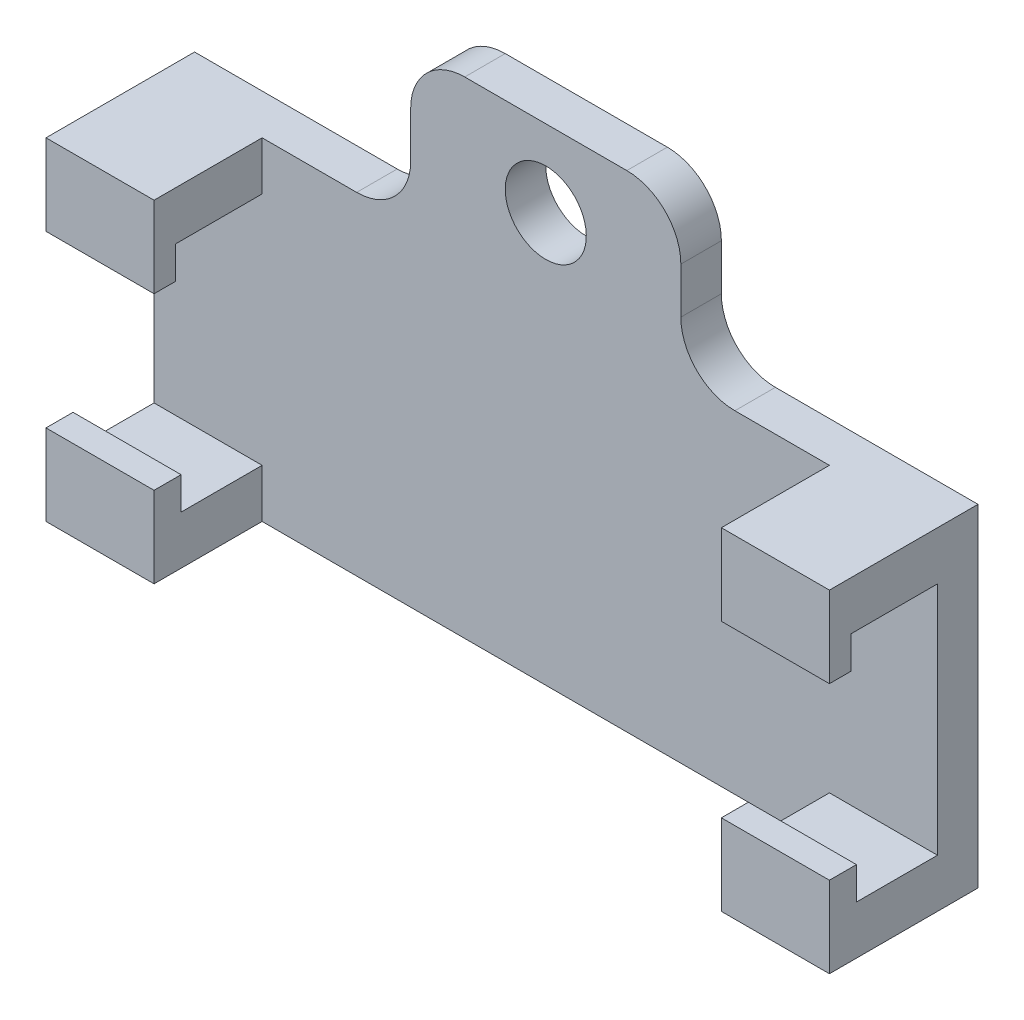
ISO-10303-21;
HEADER;
FILE_DESCRIPTION(('STEP AP214'),'2;1');
FILE_NAME('part.step','',(''),(''),'','','');
FILE_SCHEMA(('AUTOMOTIVE_DESIGN { 1 0 10303 214 1 1 1 1 }'));
ENDSEC;
DATA;
#1=APPLICATION_CONTEXT('core data for automotive mechanical design processes');
#2=APPLICATION_PROTOCOL_DEFINITION('international standard','automotive_design',2000,#1);
#3=PRODUCT_CONTEXT('',#1,'mechanical');
#4=PRODUCT('Part','Part','',(#3));
#5=PRODUCT_RELATED_PRODUCT_CATEGORY('part','',(#4));
#6=PRODUCT_DEFINITION_FORMATION('','',#4);
#7=PRODUCT_DEFINITION_CONTEXT('part definition',#1,'design');
#8=PRODUCT_DEFINITION('design','',#6,#7);
#9=PRODUCT_DEFINITION_SHAPE('','',#8);
#10=(LENGTH_UNIT() NAMED_UNIT(*) SI_UNIT(.MILLI.,.METRE.));
#11=(NAMED_UNIT(*) PLANE_ANGLE_UNIT() SI_UNIT($,.RADIAN.));
#12=(NAMED_UNIT(*) SI_UNIT($,.STERADIAN.) SOLID_ANGLE_UNIT());
#13=UNCERTAINTY_MEASURE_WITH_UNIT(LENGTH_MEASURE(1.E-05),#10,'distance_accuracy_value','');
#14=(GEOMETRIC_REPRESENTATION_CONTEXT(3) GLOBAL_UNCERTAINTY_ASSIGNED_CONTEXT((#13)) GLOBAL_UNIT_ASSIGNED_CONTEXT((#10,
#11,#12)) REPRESENTATION_CONTEXT('',''));
#15=CARTESIAN_POINT('',(0.,0.,0.));
#16=DIRECTION('',(0.,0.,1.));
#17=DIRECTION('',(1.,0.,0.));
#18=AXIS2_PLACEMENT_3D('',#15,#16,#17);
#19=CARTESIAN_POINT('',(0.,-2.95000000000001,-17.95));
#20=DIRECTION('',(0.,1.,0.));
#21=DIRECTION('',(-1.,0.,0.));
#22=AXIS2_PLACEMENT_3D('',#19,#20,#21);
#23=PLANE('',#22);
#24=DIRECTION('',(-1.,0.,0.));
#25=VECTOR('',#24,1.);
#26=CARTESIAN_POINT('',(0.,-2.95,-18.75));
#27=LINE('',#26,#25);
#28=CARTESIAN_POINT('',(4.,-2.95,-18.75));
#29=VERTEX_POINT('',#28);
#30=CARTESIAN_POINT('',(0.,-2.95,-18.75));
#31=VERTEX_POINT('',#30);
#32=EDGE_CURVE('E445',#29,#31,#27,.T.);
#33=ORIENTED_EDGE('',*,*,#32,.F.);
#34=DIRECTION('',(0.,0.,1.));
#35=VECTOR('',#34,1.);
#36=CARTESIAN_POINT('',(4.,-2.95000000000001,-17.95));
#37=LINE('',#36,#35);
#38=CARTESIAN_POINT('',(4.,-2.95000000000001,-17.95));
#39=VERTEX_POINT('',#38);
#40=EDGE_CURVE('E411',#29,#39,#37,.T.);
#41=ORIENTED_EDGE('',*,*,#40,.T.);
#42=DIRECTION('',(1.,0.,0.));
#43=VECTOR('',#42,1.);
#44=CARTESIAN_POINT('',(0.,-2.95000000000001,-17.95));
#45=LINE('',#44,#43);
#46=CARTESIAN_POINT('',(0.,-2.95000000000001,-17.95));
#47=VERTEX_POINT('',#46);
#48=EDGE_CURVE('E493',#47,#39,#45,.T.);
#49=ORIENTED_EDGE('',*,*,#48,.F.);
#50=DIRECTION('',(0.,0.,-1.));
#51=VECTOR('',#50,1.);
#52=CARTESIAN_POINT('',(0.,-2.95000000000001,-17.95));
#53=LINE('',#52,#51);
#54=EDGE_CURVE('E281',#47,#31,#53,.T.);
#55=ORIENTED_EDGE('',*,*,#54,.T.);
#56=EDGE_LOOP('',(#33,#41,#49,#55));
#57=FACE_BOUND('',#56,.T.);
#58=ADVANCED_FACE('F39',(#57),#23,.F.);
#59=CARTESIAN_POINT('',(0.,0.049999999999991,-17.95));
#60=DIRECTION('',(0.,-1.,0.));
#61=DIRECTION('',(1.,0.,0.));
#62=AXIS2_PLACEMENT_3D('',#59,#60,#61);
#63=PLANE('',#62);
#64=DIRECTION('',(1.,0.,0.));
#65=VECTOR('',#64,1.);
#66=CARTESIAN_POINT('',(0.,0.0500000000000049,-21.95));
#67=LINE('',#66,#65);
#68=CARTESIAN_POINT('',(4.,0.0500000000000049,-21.95));
#69=VERTEX_POINT('',#68);
#70=CARTESIAN_POINT('',(7.5,0.0500000000000049,-21.95));
#71=VERTEX_POINT('',#70);
#72=EDGE_CURVE('E353',#69,#71,#67,.T.);
#73=ORIENTED_EDGE('',*,*,#72,.T.);
#74=DIRECTION('',(0.,0.,1.));
#75=VECTOR('',#74,1.);
#76=CARTESIAN_POINT('',(7.5,0.0500000000000118,-23.45));
#77=LINE('',#76,#75);
#78=CARTESIAN_POINT('',(7.5,0.0500000000000118,-23.45));
#79=VERTEX_POINT('',#78);
#80=EDGE_CURVE('E268',#71,#79,#77,.F.);
#81=ORIENTED_EDGE('',*,*,#80,.T.);
#82=DIRECTION('',(1.,0.,0.));
#83=VECTOR('',#82,1.);
#84=CARTESIAN_POINT('',(0.,0.0500000000000118,-23.45));
#85=LINE('',#84,#83);
#86=CARTESIAN_POINT('',(0.,0.0500000000000118,-23.45));
#87=VERTEX_POINT('',#86);
#88=EDGE_CURVE('E264',#87,#79,#85,.T.);
#89=ORIENTED_EDGE('',*,*,#88,.F.);
#90=DIRECTION('',(0.,0.,-1.));
#91=VECTOR('',#90,1.);
#92=CARTESIAN_POINT('',(0.,0.049999999999991,-17.95));
#93=LINE('',#92,#91);
#94=CARTESIAN_POINT('',(0.,0.049999999999991,-17.95));
#95=VERTEX_POINT('',#94);
#96=EDGE_CURVE('E248',#95,#87,#93,.T.);
#97=ORIENTED_EDGE('',*,*,#96,.F.);
#98=DIRECTION('',(-1.,0.,0.));
#99=VECTOR('',#98,1.);
#100=CARTESIAN_POINT('',(0.,0.049999999999991,-17.95));
#101=LINE('',#100,#99);
#102=CARTESIAN_POINT('',(4.,0.049999999999991,-17.95));
#103=VERTEX_POINT('',#102);
#104=EDGE_CURVE('E498',#103,#95,#101,.T.);
#105=ORIENTED_EDGE('',*,*,#104,.F.);
#106=DIRECTION('',(0.,0.,-1.));
#107=VECTOR('',#106,1.);
#108=CARTESIAN_POINT('',(4.,0.049999999999991,-17.95));
#109=LINE('',#108,#107);
#110=EDGE_CURVE('E414',#103,#69,#109,.T.);
#111=ORIENTED_EDGE('',*,*,#110,.T.);
#112=EDGE_LOOP('',(#73,#81,#89,#97,#105,#111));
#113=FACE_BOUND('',#112,.T.);
#114=ADVANCED_FACE('F266',(#113),#63,.F.);
#115=CARTESIAN_POINT('',(0.,-17.95,-17.9500000000001));
#116=DIRECTION('',(0.,0.,-1.));
#117=DIRECTION('',(0.,1.,0.));
#118=AXIS2_PLACEMENT_3D('',#115,#116,#117);
#119=PLANE('',#118);
#120=ORIENTED_EDGE('',*,*,#48,.T.);
#121=DIRECTION('',(0.,-1.,0.));
#122=VECTOR('',#121,1.);
#123=CARTESIAN_POINT('',(4.,5.74999999999999,-17.95));
#124=LINE('',#123,#122);
#125=EDGE_CURVE('E372',#103,#39,#124,.T.);
#126=ORIENTED_EDGE('',*,*,#125,.F.);
#127=ORIENTED_EDGE('',*,*,#104,.T.);
#128=DIRECTION('',(0.,-1.,0.));
#129=VECTOR('',#128,1.);
#130=CARTESIAN_POINT('',(0.,-2.95000000000001,-17.95));
#131=LINE('',#130,#129);
#132=EDGE_CURVE('E257',#95,#47,#131,.T.);
#133=ORIENTED_EDGE('',*,*,#132,.T.);
#134=EDGE_LOOP('',(#120,#126,#127,#133));
#135=FACE_BOUND('',#134,.T.);
#136=ADVANCED_FACE('F538',(#135),#119,.F.);
#137=CARTESIAN_POINT('',(0.,-9.25000000000001,-17.95));
#138=DIRECTION('',(0.,-1.,0.));
#139=DIRECTION('',(1.,0.,0.));
#140=AXIS2_PLACEMENT_3D('',#137,#138,#139);
#141=PLANE('',#140);
#142=DIRECTION('',(-1.,0.,0.));
#143=VECTOR('',#142,1.);
#144=CARTESIAN_POINT('',(0.,-9.25000000000001,-17.95));
#145=LINE('',#144,#143);
#146=CARTESIAN_POINT('',(4.,-9.25,-17.95));
#147=VERTEX_POINT('',#146);
#148=CARTESIAN_POINT('',(0.,-9.25000000000001,-17.95));
#149=VERTEX_POINT('',#148);
#150=EDGE_CURVE('E477',#147,#149,#145,.T.);
#151=ORIENTED_EDGE('',*,*,#150,.F.);
#152=DIRECTION('',(0.,0.,-1.));
#153=VECTOR('',#152,1.);
#154=CARTESIAN_POINT('',(4.,-9.25000000000001,-17.95));
#155=LINE('',#154,#153);
#156=CARTESIAN_POINT('',(4.,-9.25,-18.95));
#157=VERTEX_POINT('',#156);
#158=EDGE_CURVE('E402',#147,#157,#155,.T.);
#159=ORIENTED_EDGE('',*,*,#158,.T.);
#160=DIRECTION('',(1.,0.,0.));
#161=VECTOR('',#160,1.);
#162=CARTESIAN_POINT('',(29.,-9.25,-18.95));
#163=LINE('',#162,#161);
#164=CARTESIAN_POINT('',(0.,-9.25,-18.95));
#165=VERTEX_POINT('',#164);
#166=EDGE_CURVE('E429',#165,#157,#163,.T.);
#167=ORIENTED_EDGE('',*,*,#166,.F.);
#168=DIRECTION('',(0.,0.,-1.));
#169=VECTOR('',#168,1.);
#170=CARTESIAN_POINT('',(0.,-9.25000000000001,-17.95));
#171=LINE('',#170,#169);
#172=EDGE_CURVE('E481',#149,#165,#171,.T.);
#173=ORIENTED_EDGE('',*,*,#172,.F.);
#174=EDGE_LOOP('',(#151,#159,#167,#173));
#175=FACE_BOUND('',#174,.T.);
#176=ADVANCED_FACE('F563',(#175),#141,.F.);
#177=CARTESIAN_POINT('',(0.,-17.95,-17.9500000000001));
#178=DIRECTION('',(0.,0.,1.));
#179=DIRECTION('',(0.,-1.,0.));
#180=AXIS2_PLACEMENT_3D('',#177,#178,#179);
#181=PLANE('',#180);
#182=CARTESIAN_POINT('',(4.,-12.25,-17.9500000000001));
#183=VERTEX_POINT('',#182);
#184=EDGE_CURVE('E370',#147,#183,#124,.T.);
#185=ORIENTED_EDGE('',*,*,#184,.F.);
#186=ORIENTED_EDGE('',*,*,#150,.T.);
#187=DIRECTION('',(0.,-1.,0.));
#188=VECTOR('',#187,1.);
#189=CARTESIAN_POINT('',(0.,-9.25000000000001,-17.95));
#190=LINE('',#189,#188);
#191=CARTESIAN_POINT('',(0.,-12.25,-17.9500000000001));
#192=VERTEX_POINT('',#191);
#193=EDGE_CURVE('E467',#149,#192,#190,.T.);
#194=ORIENTED_EDGE('',*,*,#193,.T.);
#195=DIRECTION('',(1.,0.,0.));
#196=VECTOR('',#195,1.);
#197=CARTESIAN_POINT('',(0.,-12.25,-17.9500000000001));
#198=LINE('',#197,#196);
#199=EDGE_CURVE('E472',#192,#183,#198,.T.);
#200=ORIENTED_EDGE('',*,*,#199,.T.);
#201=EDGE_LOOP('',(#185,#186,#194,#200));
#202=FACE_BOUND('',#201,.T.);
#203=ADVANCED_FACE('F567',(#202),#181,.T.);
#204=CARTESIAN_POINT('',(0.,-1.75000000000001,-18.75));
#205=DIRECTION('',(0.,0.,1.));
#206=DIRECTION('',(0.,-1.,0.));
#207=AXIS2_PLACEMENT_3D('',#204,#205,#206);
#208=PLANE('',#207);
#209=DIRECTION('',(-1.,0.,0.));
#210=VECTOR('',#209,1.);
#211=CARTESIAN_POINT('',(0.,-1.75000000000001,-18.75));
#212=LINE('',#211,#210);
#213=CARTESIAN_POINT('',(4.,-1.75000000000001,-18.75));
#214=VERTEX_POINT('',#213);
#215=CARTESIAN_POINT('',(0.,-1.75000000000001,-18.75));
#216=VERTEX_POINT('',#215);
#217=EDGE_CURVE('E457',#214,#216,#212,.T.);
#218=ORIENTED_EDGE('',*,*,#217,.F.);
#219=DIRECTION('',(0.,-1.,0.));
#220=VECTOR('',#219,1.);
#221=CARTESIAN_POINT('',(4.,-1.75000000000001,-18.75));
#222=LINE('',#221,#220);
#223=EDGE_CURVE('E408',#214,#29,#222,.T.);
#224=ORIENTED_EDGE('',*,*,#223,.T.);
#225=ORIENTED_EDGE('',*,*,#32,.T.);
#226=DIRECTION('',(0.,-1.,0.));
#227=VECTOR('',#226,1.);
#228=CARTESIAN_POINT('',(0.,-1.75000000000001,-18.75));
#229=LINE('',#228,#227);
#230=EDGE_CURVE('E464',#216,#31,#229,.T.);
#231=ORIENTED_EDGE('',*,*,#230,.F.);
#232=EDGE_LOOP('',(#218,#224,#225,#231));
#233=FACE_BOUND('',#232,.T.);
#234=ADVANCED_FACE('F543',(#233),#208,.F.);
#235=CARTESIAN_POINT('',(0.,-1.74999999999999,-23.45));
#236=DIRECTION('',(0.,1.,0.));
#237=DIRECTION('',(-1.,0.,0.));
#238=AXIS2_PLACEMENT_3D('',#235,#236,#237);
#239=PLANE('',#238);
#240=DIRECTION('',(1.,0.,0.));
#241=VECTOR('',#240,1.);
#242=CARTESIAN_POINT('',(0.,-1.74999999999999,-21.95));
#243=LINE('',#242,#241);
#244=CARTESIAN_POINT('',(0.,-1.74999999999999,-21.95));
#245=VERTEX_POINT('',#244);
#246=CARTESIAN_POINT('',(4.,-1.74999999999999,-21.95));
#247=VERTEX_POINT('',#246);
#248=EDGE_CURVE('E452',#245,#247,#243,.T.);
#249=ORIENTED_EDGE('',*,*,#248,.T.);
#250=DIRECTION('',(0.,0.,1.));
#251=VECTOR('',#250,1.);
#252=CARTESIAN_POINT('',(4.,-1.74999999999999,-23.45));
#253=LINE('',#252,#251);
#254=EDGE_CURVE('E405',#247,#214,#253,.T.);
#255=ORIENTED_EDGE('',*,*,#254,.T.);
#256=ORIENTED_EDGE('',*,*,#217,.T.);
#257=DIRECTION('',(0.,0.,-1.));
#258=VECTOR('',#257,1.);
#259=CARTESIAN_POINT('',(0.,-1.74999999999999,-21.95));
#260=LINE('',#259,#258);
#261=EDGE_CURVE('E447',#216,#245,#260,.T.);
#262=ORIENTED_EDGE('',*,*,#261,.T.);
#263=EDGE_LOOP('',(#249,#255,#256,#262));
#264=FACE_BOUND('',#263,.T.);
#265=ADVANCED_FACE('F547',(#264),#239,.F.);
#266=CARTESIAN_POINT('',(29.,-10.45,-18.95));
#267=DIRECTION('',(0.,0.,1.));
#268=DIRECTION('',(0.,-1.,0.));
#269=AXIS2_PLACEMENT_3D('',#266,#267,#268);
#270=PLANE('',#269);
#271=ORIENTED_EDGE('',*,*,#166,.T.);
#272=DIRECTION('',(0.,-1.,0.));
#273=VECTOR('',#272,1.);
#274=CARTESIAN_POINT('',(4.,-10.45,-18.95));
#275=LINE('',#274,#273);
#276=CARTESIAN_POINT('',(4.,-10.45,-18.95));
#277=VERTEX_POINT('',#276);
#278=EDGE_CURVE('E399',#157,#277,#275,.T.);
#279=ORIENTED_EDGE('',*,*,#278,.T.);
#280=DIRECTION('',(1.,0.,0.));
#281=VECTOR('',#280,1.);
#282=CARTESIAN_POINT('',(29.,-10.45,-18.95));
#283=LINE('',#282,#281);
#284=CARTESIAN_POINT('',(0.,-10.45,-18.95));
#285=VERTEX_POINT('',#284);
#286=EDGE_CURVE('E436',#285,#277,#283,.T.);
#287=ORIENTED_EDGE('',*,*,#286,.F.);
#288=DIRECTION('',(0.,1.,0.));
#289=VECTOR('',#288,1.);
#290=CARTESIAN_POINT('',(0.,-10.45,-18.95));
#291=LINE('',#290,#289);
#292=EDGE_CURVE('E439',#285,#165,#291,.T.);
#293=ORIENTED_EDGE('',*,*,#292,.T.);
#294=EDGE_LOOP('',(#271,#279,#287,#293));
#295=FACE_BOUND('',#294,.T.);
#296=ADVANCED_FACE('F556',(#295),#270,.F.);
#297=CARTESIAN_POINT('',(0.,-10.45,-23.45));
#298=DIRECTION('',(0.,-1.,0.));
#299=DIRECTION('',(1.,0.,0.));
#300=AXIS2_PLACEMENT_3D('',#297,#298,#299);
#301=PLANE('',#300);
#302=ORIENTED_EDGE('',*,*,#286,.T.);
#303=DIRECTION('',(0.,0.,-1.));
#304=VECTOR('',#303,1.);
#305=CARTESIAN_POINT('',(4.,-10.45,-23.45));
#306=LINE('',#305,#304);
#307=CARTESIAN_POINT('',(4.,-10.45,-21.95));
#308=VERTEX_POINT('',#307);
#309=EDGE_CURVE('E299',#277,#308,#306,.T.);
#310=ORIENTED_EDGE('',*,*,#309,.T.);
#311=DIRECTION('',(-1.,0.,0.));
#312=VECTOR('',#311,1.);
#313=CARTESIAN_POINT('',(29.,-10.45,-21.95));
#314=LINE('',#313,#312);
#315=CARTESIAN_POINT('',(0.,-10.45,-21.95));
#316=VERTEX_POINT('',#315);
#317=EDGE_CURVE('E428',#308,#316,#314,.T.);
#318=ORIENTED_EDGE('',*,*,#317,.T.);
#319=DIRECTION('',(0.,0.,1.));
#320=VECTOR('',#319,1.);
#321=CARTESIAN_POINT('',(0.,-10.45,-21.95));
#322=LINE('',#321,#320);
#323=EDGE_CURVE('E433',#316,#285,#322,.T.);
#324=ORIENTED_EDGE('',*,*,#323,.T.);
#325=EDGE_LOOP('',(#302,#310,#318,#324));
#326=FACE_BOUND('',#325,.T.);
#327=ADVANCED_FACE('F554',(#326),#301,.F.);
#328=CARTESIAN_POINT('',(0.,-17.95,-21.9500000000001));
#329=DIRECTION('',(1.,0.,0.));
#330=DIRECTION('',(0.,1.,0.));
#331=AXIS2_PLACEMENT_3D('',#328,#329,#330);
#332=PLANE('',#331);
#333=ORIENTED_EDGE('',*,*,#96,.T.);
#334=DIRECTION('',(0.,-1.,0.));
#335=VECTOR('',#334,1.);
#336=CARTESIAN_POINT('',(0.,-17.95,-23.4500000000001));
#337=LINE('',#336,#335);
#338=CARTESIAN_POINT('',(0.,-12.25,-23.4500000000001));
#339=VERTEX_POINT('',#338);
#340=EDGE_CURVE('E253',#87,#339,#337,.T.);
#341=ORIENTED_EDGE('',*,*,#340,.T.);
#342=DIRECTION('',(0.,0.,-1.));
#343=VECTOR('',#342,1.);
#344=CARTESIAN_POINT('',(0.,-12.25,-17.9500000000001));
#345=LINE('',#344,#343);
#346=EDGE_CURVE('E489',#192,#339,#345,.T.);
#347=ORIENTED_EDGE('',*,*,#346,.F.);
#348=ORIENTED_EDGE('',*,*,#193,.F.);
#349=ORIENTED_EDGE('',*,*,#172,.T.);
#350=ORIENTED_EDGE('',*,*,#292,.F.);
#351=ORIENTED_EDGE('',*,*,#323,.F.);
#352=DIRECTION('',(0.,-1.,0.));
#353=VECTOR('',#352,1.);
#354=CARTESIAN_POINT('',(0.,-17.95,-21.9500000000001));
#355=LINE('',#354,#353);
#356=EDGE_CURVE('E295',#245,#316,#355,.T.);
#357=ORIENTED_EDGE('',*,*,#356,.F.);
#358=ORIENTED_EDGE('',*,*,#261,.F.);
#359=ORIENTED_EDGE('',*,*,#230,.T.);
#360=ORIENTED_EDGE('',*,*,#54,.F.);
#361=ORIENTED_EDGE('',*,*,#132,.F.);
#362=EDGE_LOOP('',(#333,#341,#347,#348,#349,#350,#351,#357,#358,#359,#360,#361));
#363=FACE_BOUND('',#362,.T.);
#364=ADVANCED_FACE('F250',(#363),#332,.F.);
#365=CARTESIAN_POINT('',(29.,-17.95,-21.9500000000001));
#366=DIRECTION('',(-1.,0.,0.));
#367=DIRECTION('',(0.,-1.,0.));
#368=AXIS2_PLACEMENT_3D('',#365,#366,#367);
#369=PLANE('',#368);
#370=DIRECTION('',(0.,1.,0.));
#371=VECTOR('',#370,1.);
#372=CARTESIAN_POINT('',(29.,-17.95,-23.4500000000001));
#373=LINE('',#372,#371);
#374=CARTESIAN_POINT('',(29.,-12.25,-23.4500000000001));
#375=VERTEX_POINT('',#374);
#376=CARTESIAN_POINT('',(29.,0.0500000000000153,-23.45));
#377=VERTEX_POINT('',#376);
#378=EDGE_CURVE('E280',#375,#377,#373,.T.);
#379=ORIENTED_EDGE('',*,*,#378,.T.);
#380=DIRECTION('',(0.,0.,-1.));
#381=VECTOR('',#380,1.);
#382=CARTESIAN_POINT('',(29.,0.049999999999991,-17.95));
#383=LINE('',#382,#381);
#384=CARTESIAN_POINT('',(29.,0.049999999999991,-17.95));
#385=VERTEX_POINT('',#384);
#386=EDGE_CURVE('E260',#385,#377,#383,.T.);
#387=ORIENTED_EDGE('',*,*,#386,.F.);
#388=DIRECTION('',(0.,1.,0.));
#389=VECTOR('',#388,1.);
#390=CARTESIAN_POINT('',(29.,-2.95000000000001,-17.95));
#391=LINE('',#390,#389);
#392=CARTESIAN_POINT('',(29.,-2.95000000000001,-17.95));
#393=VERTEX_POINT('',#392);
#394=EDGE_CURVE('E496',#393,#385,#391,.T.);
#395=ORIENTED_EDGE('',*,*,#394,.F.);
#396=DIRECTION('',(0.,0.,-1.));
#397=VECTOR('',#396,1.);
#398=CARTESIAN_POINT('',(29.,-2.95000000000001,-17.95));
#399=LINE('',#398,#397);
#400=CARTESIAN_POINT('',(29.,-2.95,-18.75));
#401=VERTEX_POINT('',#400);
#402=EDGE_CURVE('E287',#393,#401,#399,.T.);
#403=ORIENTED_EDGE('',*,*,#402,.T.);
#404=DIRECTION('',(0.,-1.,0.));
#405=VECTOR('',#404,1.);
#406=CARTESIAN_POINT('',(29.,-1.75000000000001,-18.75));
#407=LINE('',#406,#405);
#408=CARTESIAN_POINT('',(29.,-1.75000000000001,-18.75));
#409=VERTEX_POINT('',#408);
#410=EDGE_CURVE('E461',#409,#401,#407,.T.);
#411=ORIENTED_EDGE('',*,*,#410,.F.);
#412=DIRECTION('',(0.,0.,1.));
#413=VECTOR('',#412,1.);
#414=CARTESIAN_POINT('',(29.,-1.74999999999999,-21.95));
#415=LINE('',#414,#413);
#416=CARTESIAN_POINT('',(29.,-1.74999999999999,-21.95));
#417=VERTEX_POINT('',#416);
#418=EDGE_CURVE('E455',#417,#409,#415,.T.);
#419=ORIENTED_EDGE('',*,*,#418,.F.);
#420=DIRECTION('',(0.,1.,0.));
#421=VECTOR('',#420,1.);
#422=CARTESIAN_POINT('',(29.,-17.95,-21.9500000000001));
#423=LINE('',#422,#421);
#424=CARTESIAN_POINT('',(29.,-10.45,-21.95));
#425=VERTEX_POINT('',#424);
#426=EDGE_CURVE('E505',#425,#417,#423,.T.);
#427=ORIENTED_EDGE('',*,*,#426,.F.);
#428=DIRECTION('',(0.,0.,-1.));
#429=VECTOR('',#428,1.);
#430=CARTESIAN_POINT('',(29.,-10.45,-21.95));
#431=LINE('',#430,#429);
#432=CARTESIAN_POINT('',(29.,-10.45,-18.95));
#433=VERTEX_POINT('',#432);
#434=EDGE_CURVE('E425',#433,#425,#431,.T.);
#435=ORIENTED_EDGE('',*,*,#434,.F.);
#436=DIRECTION('',(0.,1.,0.));
#437=VECTOR('',#436,1.);
#438=CARTESIAN_POINT('',(29.,-10.45,-18.95));
#439=LINE('',#438,#437);
#440=CARTESIAN_POINT('',(29.,-9.25,-18.95));
#441=VERTEX_POINT('',#440);
#442=EDGE_CURVE('E442',#433,#441,#439,.T.);
#443=ORIENTED_EDGE('',*,*,#442,.T.);
#444=DIRECTION('',(0.,0.,-1.));
#445=VECTOR('',#444,1.);
#446=CARTESIAN_POINT('',(29.,-9.25,-17.95));
#447=LINE('',#446,#445);
#448=CARTESIAN_POINT('',(29.,-9.25,-17.95));
#449=VERTEX_POINT('',#448);
#450=EDGE_CURVE('E484',#449,#441,#447,.T.);
#451=ORIENTED_EDGE('',*,*,#450,.F.);
#452=DIRECTION('',(0.,1.,0.));
#453=VECTOR('',#452,1.);
#454=CARTESIAN_POINT('',(29.,-9.25,-17.95));
#455=LINE('',#454,#453);
#456=CARTESIAN_POINT('',(29.,-12.25,-17.9500000000001));
#457=VERTEX_POINT('',#456);
#458=EDGE_CURVE('E475',#457,#449,#455,.T.);
#459=ORIENTED_EDGE('',*,*,#458,.F.);
#460=DIRECTION('',(0.,0.,-1.));
#461=VECTOR('',#460,1.);
#462=CARTESIAN_POINT('',(29.,-12.25,-17.9500000000001));
#463=LINE('',#462,#461);
#464=EDGE_CURVE('E487',#457,#375,#463,.T.);
#465=ORIENTED_EDGE('',*,*,#464,.T.);
#466=EDGE_LOOP('',(#379,#387,#395,#403,#411,#419,#427,#435,#443,#451,#459,#465));
#467=FACE_BOUND('',#466,.T.);
#468=ADVANCED_FACE('F583',(#467),#369,.F.);
#469=CARTESIAN_POINT('',(0.,-17.95,-23.4500000000001));
#470=DIRECTION('',(0.,0.,-1.));
#471=DIRECTION('',(0.,1.,0.));
#472=AXIS2_PLACEMENT_3D('',#469,#470,#471);
#473=PLANE('',#472);
#474=DIRECTION('',(0.,1.,0.));
#475=VECTOR('',#474,1.);
#476=CARTESIAN_POINT('',(9.5,5.75000000000002,-23.45));
#477=LINE('',#476,#475);
#478=CARTESIAN_POINT('',(9.5,2.05000000000001,-23.45));
#479=VERTEX_POINT('',#478);
#480=CARTESIAN_POINT('',(9.5,3.75000000000002,-23.45));
#481=VERTEX_POINT('',#480);
#482=EDGE_CURVE('E270',#479,#481,#477,.T.);
#483=ORIENTED_EDGE('',*,*,#482,.T.);
#484=CARTESIAN_POINT('',(11.5,3.75000000000002,-23.45));
#485=DIRECTION('',(0.,0.,-1.));
#486=DIRECTION('',(0.,1.,0.));
#487=AXIS2_PLACEMENT_3D('',#484,#485,#486);
#488=CIRCLE('',#487,2.);
#489=CARTESIAN_POINT('',(11.5,5.75000000000002,-23.45));
#490=VERTEX_POINT('',#489);
#491=EDGE_CURVE('E319',#481,#490,#488,.T.);
#492=ORIENTED_EDGE('',*,*,#491,.T.);
#493=DIRECTION('',(-1.,0.,0.));
#494=VECTOR('',#493,1.);
#495=CARTESIAN_POINT('',(0.,5.75000000000002,-23.45));
#496=LINE('',#495,#494);
#497=CARTESIAN_POINT('',(17.5,5.75000000000002,-23.45));
#498=VERTEX_POINT('',#497);
#499=EDGE_CURVE('E284',#498,#490,#496,.T.);
#500=ORIENTED_EDGE('',*,*,#499,.F.);
#501=CARTESIAN_POINT('',(17.5,3.75000000000002,-23.45));
#502=DIRECTION('',(0.,0.,-1.));
#503=DIRECTION('',(0.,1.,0.));
#504=AXIS2_PLACEMENT_3D('',#501,#502,#503);
#505=CIRCLE('',#504,2.);
#506=CARTESIAN_POINT('',(19.5,3.75000000000002,-23.45));
#507=VERTEX_POINT('',#506);
#508=EDGE_CURVE('E317',#498,#507,#505,.T.);
#509=ORIENTED_EDGE('',*,*,#508,.T.);
#510=DIRECTION('',(0.,-1.,0.));
#511=VECTOR('',#510,1.);
#512=CARTESIAN_POINT('',(19.5,5.75000000000002,-23.45));
#513=LINE('',#512,#511);
#514=CARTESIAN_POINT('',(19.5,2.05000000000001,-23.45));
#515=VERTEX_POINT('',#514);
#516=EDGE_CURVE('E354',#507,#515,#513,.T.);
#517=ORIENTED_EDGE('',*,*,#516,.T.);
#518=CARTESIAN_POINT('',(21.5,2.05000000000001,-23.45));
#519=DIRECTION('',(0.,0.,-1.));
#520=DIRECTION('',(0.,1.,0.));
#521=AXIS2_PLACEMENT_3D('',#518,#519,#520);
#522=CIRCLE('',#521,2.);
#523=CARTESIAN_POINT('',(21.5,0.0500000000000118,-23.45));
#524=VERTEX_POINT('',#523);
#525=EDGE_CURVE('E12',#515,#524,#522,.F.);
#526=ORIENTED_EDGE('',*,*,#525,.T.);
#527=DIRECTION('',(1.,0.,0.));
#528=VECTOR('',#527,1.);
#529=CARTESIAN_POINT('',(29.,0.0500000000000153,-23.45));
#530=LINE('',#529,#528);
#531=EDGE_CURVE('E350',#524,#377,#530,.T.);
#532=ORIENTED_EDGE('',*,*,#531,.T.);
#533=ORIENTED_EDGE('',*,*,#378,.F.);
#534=DIRECTION('',(-1.,0.,0.));
#535=VECTOR('',#534,1.);
#536=CARTESIAN_POINT('',(0.,-12.25,-23.4500000000001));
#537=LINE('',#536,#535);
#538=EDGE_CURVE('E279',#375,#339,#537,.T.);
#539=ORIENTED_EDGE('',*,*,#538,.T.);
#540=ORIENTED_EDGE('',*,*,#340,.F.);
#541=ORIENTED_EDGE('',*,*,#88,.T.);
#542=CARTESIAN_POINT('',(7.5,2.05000000000001,-23.45));
#543=DIRECTION('',(0.,0.,-1.));
#544=DIRECTION('',(0.,1.,0.));
#545=AXIS2_PLACEMENT_3D('',#542,#543,#544);
#546=CIRCLE('',#545,2.);
#547=EDGE_CURVE('E330',#79,#479,#546,.F.);
#548=ORIENTED_EDGE('',*,*,#547,.T.);
#549=EDGE_LOOP('',(#483,#492,#500,#509,#517,#526,#532,#533,#539,#540,#541,#548));
#550=FACE_BOUND('',#549,.T.);
#551=CARTESIAN_POINT('',(14.5,2.90000000000001,-23.45));
#552=DIRECTION('',(0.,0.,1.));
#553=DIRECTION('',(0.,-1.,0.));
#554=AXIS2_PLACEMENT_3D('',#551,#552,#553);
#555=CIRCLE('',#554,1.5);
#556=CARTESIAN_POINT('',(14.5,1.40000000000001,-23.45));
#557=VERTEX_POINT('',#556);
#558=EDGE_CURVE('E419',#557,#557,#555,.T.);
#559=ORIENTED_EDGE('',*,*,#558,.T.);
#560=EDGE_LOOP('',(#559));
#561=FACE_BOUND('',#560,.T.);
#562=ADVANCED_FACE('F275',(#550,#561),#473,.T.);
#563=CARTESIAN_POINT('',(0.,-17.95,-21.9500000000001));
#564=DIRECTION('',(0.,0.,-1.));
#565=DIRECTION('',(0.,1.,0.));
#566=AXIS2_PLACEMENT_3D('',#563,#564,#565);
#567=PLANE('',#566);
#568=DIRECTION('',(-1.,0.,0.));
#569=VECTOR('',#568,1.);
#570=CARTESIAN_POINT('',(0.,5.75000000000001,-21.95));
#571=LINE('',#570,#569);
#572=CARTESIAN_POINT('',(17.5,5.75000000000001,-21.95));
#573=VERTEX_POINT('',#572);
#574=CARTESIAN_POINT('',(11.5,5.75000000000001,-21.95));
#575=VERTEX_POINT('',#574);
#576=EDGE_CURVE('E290',#573,#575,#571,.T.);
#577=ORIENTED_EDGE('',*,*,#576,.T.);
#578=CARTESIAN_POINT('',(11.5,3.75000000000001,-21.95));
#579=DIRECTION('',(0.,0.,-1.));
#580=DIRECTION('',(0.,1.,0.));
#581=AXIS2_PLACEMENT_3D('',#578,#579,#580);
#582=CIRCLE('',#581,2.);
#583=CARTESIAN_POINT('',(9.5,3.75000000000001,-21.95));
#584=VERTEX_POINT('',#583);
#585=EDGE_CURVE('E315',#575,#584,#582,.F.);
#586=ORIENTED_EDGE('',*,*,#585,.T.);
#587=DIRECTION('',(0.,1.,0.));
#588=VECTOR('',#587,1.);
#589=CARTESIAN_POINT('',(9.5,5.75000000000001,-21.95));
#590=LINE('',#589,#588);
#591=CARTESIAN_POINT('',(9.5,2.05,-21.95));
#592=VERTEX_POINT('',#591);
#593=EDGE_CURVE('E271',#592,#584,#590,.T.);
#594=ORIENTED_EDGE('',*,*,#593,.F.);
#595=CARTESIAN_POINT('',(7.5,2.05,-21.95));
#596=DIRECTION('',(0.,0.,-1.));
#597=DIRECTION('',(0.,1.,0.));
#598=AXIS2_PLACEMENT_3D('',#595,#596,#597);
#599=CIRCLE('',#598,2.);
#600=EDGE_CURVE('E328',#592,#71,#599,.T.);
#601=ORIENTED_EDGE('',*,*,#600,.T.);
#602=ORIENTED_EDGE('',*,*,#72,.F.);
#603=DIRECTION('',(0.,-1.,0.));
#604=VECTOR('',#603,1.);
#605=CARTESIAN_POINT('',(4.,5.75000000000001,-21.95));
#606=LINE('',#605,#604);
#607=EDGE_CURVE('E380',#69,#247,#606,.T.);
#608=ORIENTED_EDGE('',*,*,#607,.T.);
#609=ORIENTED_EDGE('',*,*,#248,.F.);
#610=ORIENTED_EDGE('',*,*,#356,.T.);
#611=ORIENTED_EDGE('',*,*,#317,.F.);
#612=CARTESIAN_POINT('',(4.,-12.25,-21.9500000000001));
#613=VERTEX_POINT('',#612);
#614=EDGE_CURVE('E369',#308,#613,#606,.T.);
#615=ORIENTED_EDGE('',*,*,#614,.T.);
#616=DIRECTION('',(1.,0.,0.));
#617=VECTOR('',#616,1.);
#618=CARTESIAN_POINT('',(4.,-12.25,-21.9500000000001));
#619=LINE('',#618,#617);
#620=CARTESIAN_POINT('',(25.,-12.25,-21.9500000000001));
#621=VERTEX_POINT('',#620);
#622=EDGE_CURVE('E364',#613,#621,#619,.T.);
#623=ORIENTED_EDGE('',*,*,#622,.T.);
#624=DIRECTION('',(0.,-1.,0.));
#625=VECTOR('',#624,1.);
#626=CARTESIAN_POINT('',(25.,5.75000000000001,-21.95));
#627=LINE('',#626,#625);
#628=CARTESIAN_POINT('',(25.,-10.45,-21.95));
#629=VERTEX_POINT('',#628);
#630=EDGE_CURVE('E378',#629,#621,#627,.T.);
#631=ORIENTED_EDGE('',*,*,#630,.F.);
#632=EDGE_CURVE('E430',#425,#629,#314,.T.);
#633=ORIENTED_EDGE('',*,*,#632,.F.);
#634=ORIENTED_EDGE('',*,*,#426,.T.);
#635=CARTESIAN_POINT('',(25.,-1.74999999999999,-21.95));
#636=VERTEX_POINT('',#635);
#637=EDGE_CURVE('E450',#636,#417,#243,.T.);
#638=ORIENTED_EDGE('',*,*,#637,.F.);
#639=CARTESIAN_POINT('',(25.,0.0500000000000049,-21.95));
#640=VERTEX_POINT('',#639);
#641=EDGE_CURVE('E377',#640,#636,#627,.T.);
#642=ORIENTED_EDGE('',*,*,#641,.F.);
#643=DIRECTION('',(1.,0.,0.));
#644=VECTOR('',#643,1.);
#645=CARTESIAN_POINT('',(29.,0.0500000000000084,-21.95));
#646=LINE('',#645,#644);
#647=CARTESIAN_POINT('',(21.5,0.0500000000000049,-21.95));
#648=VERTEX_POINT('',#647);
#649=EDGE_CURVE('E339',#648,#640,#646,.T.);
#650=ORIENTED_EDGE('',*,*,#649,.F.);
#651=CARTESIAN_POINT('',(21.5,2.05,-21.95));
#652=DIRECTION('',(0.,0.,-1.));
#653=DIRECTION('',(0.,1.,0.));
#654=AXIS2_PLACEMENT_3D('',#651,#652,#653);
#655=CIRCLE('',#654,2.);
#656=CARTESIAN_POINT('',(19.5,2.05,-21.95));
#657=VERTEX_POINT('',#656);
#658=EDGE_CURVE('E47',#648,#657,#655,.T.);
#659=ORIENTED_EDGE('',*,*,#658,.T.);
#660=DIRECTION('',(0.,-1.,0.));
#661=VECTOR('',#660,1.);
#662=CARTESIAN_POINT('',(19.5,5.75000000000001,-21.95));
#663=LINE('',#662,#661);
#664=CARTESIAN_POINT('',(19.5,3.75000000000001,-21.95));
#665=VERTEX_POINT('',#664);
#666=EDGE_CURVE('E337',#665,#657,#663,.T.);
#667=ORIENTED_EDGE('',*,*,#666,.F.);
#668=CARTESIAN_POINT('',(17.5,3.75000000000001,-21.95));
#669=DIRECTION('',(0.,0.,-1.));
#670=DIRECTION('',(0.,1.,0.));
#671=AXIS2_PLACEMENT_3D('',#668,#669,#670);
#672=CIRCLE('',#671,2.);
#673=EDGE_CURVE('E313',#665,#573,#672,.F.);
#674=ORIENTED_EDGE('',*,*,#673,.T.);
#675=EDGE_LOOP('',(#577,#586,#594,#601,#602,#608,#609,#610,#611,#615,#623,#631,#633,#634,#638,
#642,#650,#659,#667,#674));
#676=FACE_BOUND('',#675,.T.);
#677=CARTESIAN_POINT('',(14.5,2.9,-21.95));
#678=DIRECTION('',(0.,0.,1.));
#679=DIRECTION('',(0.,-1.,0.));
#680=AXIS2_PLACEMENT_3D('',#677,#678,#679);
#681=CIRCLE('',#680,1.5);
#682=CARTESIAN_POINT('',(14.5,1.4,-21.95));
#683=VERTEX_POINT('',#682);
#684=EDGE_CURVE('E418',#683,#683,#681,.T.);
#685=ORIENTED_EDGE('',*,*,#684,.F.);
#686=EDGE_LOOP('',(#685));
#687=FACE_BOUND('',#686,.T.);
#688=ADVANCED_FACE('F335',(#676,#687),#567,.F.);
#689=CARTESIAN_POINT('',(0.,5.75000000000001,-21.95));
#690=DIRECTION('',(0.,-1.,0.));
#691=DIRECTION('',(1.,0.,0.));
#692=AXIS2_PLACEMENT_3D('',#689,#690,#691);
#693=PLANE('',#692);
#694=ORIENTED_EDGE('',*,*,#499,.T.);
#695=DIRECTION('',(0.,0.,1.));
#696=VECTOR('',#695,1.);
#697=CARTESIAN_POINT('',(11.5,5.75000000000001,-21.95));
#698=LINE('',#697,#696);
#699=EDGE_CURVE('E310',#490,#575,#698,.T.);
#700=ORIENTED_EDGE('',*,*,#699,.T.);
#701=ORIENTED_EDGE('',*,*,#576,.F.);
#702=DIRECTION('',(0.,0.,1.));
#703=VECTOR('',#702,1.);
#704=CARTESIAN_POINT('',(17.5,5.75000000000001,-21.95));
#705=LINE('',#704,#703);
#706=EDGE_CURVE('E308',#573,#498,#705,.F.);
#707=ORIENTED_EDGE('',*,*,#706,.T.);
#708=EDGE_LOOP('',(#694,#700,#701,#707));
#709=FACE_BOUND('',#708,.T.);
#710=ADVANCED_FACE('F515',(#709),#693,.F.);
#711=CARTESIAN_POINT('',(25.,-2.95000000000001,-17.95));
#712=VERTEX_POINT('',#711);
#713=EDGE_CURVE('E492',#712,#393,#45,.T.);
#714=ORIENTED_EDGE('',*,*,#713,.F.);
#715=DIRECTION('',(0.,0.,-1.));
#716=VECTOR('',#715,1.);
#717=CARTESIAN_POINT('',(25.,-2.95000000000001,-17.95));
#718=LINE('',#717,#716);
#719=CARTESIAN_POINT('',(25.,-2.95,-18.75));
#720=VERTEX_POINT('',#719);
#721=EDGE_CURVE('E394',#712,#720,#718,.T.);
#722=ORIENTED_EDGE('',*,*,#721,.T.);
#723=EDGE_CURVE('E451',#401,#720,#27,.T.);
#724=ORIENTED_EDGE('',*,*,#723,.F.);
#725=ORIENTED_EDGE('',*,*,#402,.F.);
#726=EDGE_LOOP('',(#714,#722,#724,#725));
#727=FACE_BOUND('',#726,.T.);
#728=ADVANCED_FACE('F597',(#727),#23,.F.);
#729=ORIENTED_EDGE('',*,*,#531,.F.);
#730=DIRECTION('',(0.,0.,1.));
#731=VECTOR('',#730,1.);
#732=CARTESIAN_POINT('',(21.5,0.0500000000000049,-21.95));
#733=LINE('',#732,#731);
#734=EDGE_CURVE('E325',#524,#648,#733,.T.);
#735=ORIENTED_EDGE('',*,*,#734,.T.);
#736=ORIENTED_EDGE('',*,*,#649,.T.);
#737=DIRECTION('',(0.,0.,1.));
#738=VECTOR('',#737,1.);
#739=CARTESIAN_POINT('',(25.,0.049999999999991,-17.95));
#740=LINE('',#739,#738);
#741=CARTESIAN_POINT('',(25.,0.049999999999991,-17.95));
#742=VERTEX_POINT('',#741);
#743=EDGE_CURVE('E397',#640,#742,#740,.T.);
#744=ORIENTED_EDGE('',*,*,#743,.T.);
#745=EDGE_CURVE('E261',#385,#742,#101,.T.);
#746=ORIENTED_EDGE('',*,*,#745,.F.);
#747=ORIENTED_EDGE('',*,*,#386,.T.);
#748=EDGE_LOOP('',(#729,#735,#736,#744,#746,#747));
#749=FACE_BOUND('',#748,.T.);
#750=ADVANCED_FACE('F346',(#749),#63,.F.);
#751=ORIENTED_EDGE('',*,*,#745,.T.);
#752=DIRECTION('',(0.,-1.,0.));
#753=VECTOR('',#752,1.);
#754=CARTESIAN_POINT('',(25.,5.74999999999999,-17.95));
#755=LINE('',#754,#753);
#756=EDGE_CURVE('E373',#742,#712,#755,.T.);
#757=ORIENTED_EDGE('',*,*,#756,.T.);
#758=ORIENTED_EDGE('',*,*,#713,.T.);
#759=ORIENTED_EDGE('',*,*,#394,.T.);
#760=EDGE_LOOP('',(#751,#757,#758,#759));
#761=FACE_BOUND('',#760,.T.);
#762=ADVANCED_FACE('F601',(#761),#119,.F.);
#763=CARTESIAN_POINT('',(0.,-12.25,-17.9500000000001));
#764=DIRECTION('',(0.,1.,0.));
#765=DIRECTION('',(-1.,0.,0.));
#766=AXIS2_PLACEMENT_3D('',#763,#764,#765);
#767=PLANE('',#766);
#768=ORIENTED_EDGE('',*,*,#622,.F.);
#769=DIRECTION('',(0.,0.,-1.));
#770=VECTOR('',#769,1.);
#771=CARTESIAN_POINT('',(4.,-12.25,-17.9500000000001));
#772=LINE('',#771,#770);
#773=EDGE_CURVE('E361',#183,#613,#772,.T.);
#774=ORIENTED_EDGE('',*,*,#773,.F.);
#775=ORIENTED_EDGE('',*,*,#199,.F.);
#776=ORIENTED_EDGE('',*,*,#346,.T.);
#777=ORIENTED_EDGE('',*,*,#538,.F.);
#778=ORIENTED_EDGE('',*,*,#464,.F.);
#779=CARTESIAN_POINT('',(25.,-12.25,-17.9500000000001));
#780=VERTEX_POINT('',#779);
#781=EDGE_CURVE('E471',#780,#457,#198,.T.);
#782=ORIENTED_EDGE('',*,*,#781,.F.);
#783=DIRECTION('',(0.,0.,1.));
#784=VECTOR('',#783,1.);
#785=CARTESIAN_POINT('',(25.,-12.25,-17.9500000000001));
#786=LINE('',#785,#784);
#787=EDGE_CURVE('E367',#621,#780,#786,.T.);
#788=ORIENTED_EDGE('',*,*,#787,.F.);
#789=EDGE_LOOP('',(#768,#774,#775,#776,#777,#778,#782,#788));
#790=FACE_BOUND('',#789,.T.);
#791=ADVANCED_FACE('F571',(#790),#767,.F.);
#792=CARTESIAN_POINT('',(25.,-9.25,-18.95));
#793=VERTEX_POINT('',#792);
#794=EDGE_CURVE('E422',#793,#441,#163,.T.);
#795=ORIENTED_EDGE('',*,*,#794,.F.);
#796=DIRECTION('',(0.,0.,1.));
#797=VECTOR('',#796,1.);
#798=CARTESIAN_POINT('',(25.,-9.25,-17.95));
#799=LINE('',#798,#797);
#800=CARTESIAN_POINT('',(25.,-9.25,-17.95));
#801=VERTEX_POINT('',#800);
#802=EDGE_CURVE('E385',#793,#801,#799,.T.);
#803=ORIENTED_EDGE('',*,*,#802,.T.);
#804=EDGE_CURVE('E478',#449,#801,#145,.T.);
#805=ORIENTED_EDGE('',*,*,#804,.F.);
#806=ORIENTED_EDGE('',*,*,#450,.T.);
#807=EDGE_LOOP('',(#795,#803,#805,#806));
#808=FACE_BOUND('',#807,.T.);
#809=ADVANCED_FACE('F609',(#808),#141,.F.);
#810=EDGE_CURVE('E374',#801,#780,#755,.T.);
#811=ORIENTED_EDGE('',*,*,#810,.T.);
#812=ORIENTED_EDGE('',*,*,#781,.T.);
#813=ORIENTED_EDGE('',*,*,#458,.T.);
#814=ORIENTED_EDGE('',*,*,#804,.T.);
#815=EDGE_LOOP('',(#811,#812,#813,#814));
#816=FACE_BOUND('',#815,.T.);
#817=ADVANCED_FACE('F605',(#816),#181,.T.);
#818=ORIENTED_EDGE('',*,*,#723,.T.);
#819=DIRECTION('',(0.,1.,0.));
#820=VECTOR('',#819,1.);
#821=CARTESIAN_POINT('',(25.,-1.75000000000001,-18.75));
#822=LINE('',#821,#820);
#823=CARTESIAN_POINT('',(25.,-1.75000000000001,-18.75));
#824=VERTEX_POINT('',#823);
#825=EDGE_CURVE('E391',#720,#824,#822,.T.);
#826=ORIENTED_EDGE('',*,*,#825,.T.);
#827=EDGE_CURVE('E458',#409,#824,#212,.T.);
#828=ORIENTED_EDGE('',*,*,#827,.F.);
#829=ORIENTED_EDGE('',*,*,#410,.T.);
#830=EDGE_LOOP('',(#818,#826,#828,#829));
#831=FACE_BOUND('',#830,.T.);
#832=ADVANCED_FACE('F590',(#831),#208,.F.);
#833=ORIENTED_EDGE('',*,*,#827,.T.);
#834=DIRECTION('',(0.,0.,-1.));
#835=VECTOR('',#834,1.);
#836=CARTESIAN_POINT('',(25.,-1.74999999999999,-23.45));
#837=LINE('',#836,#835);
#838=EDGE_CURVE('E388',#824,#636,#837,.T.);
#839=ORIENTED_EDGE('',*,*,#838,.T.);
#840=ORIENTED_EDGE('',*,*,#637,.T.);
#841=ORIENTED_EDGE('',*,*,#418,.T.);
#842=EDGE_LOOP('',(#833,#839,#840,#841));
#843=FACE_BOUND('',#842,.T.);
#844=ADVANCED_FACE('F588',(#843),#239,.F.);
#845=CARTESIAN_POINT('',(25.,-10.45,-18.95));
#846=VERTEX_POINT('',#845);
#847=EDGE_CURVE('E435',#846,#433,#283,.T.);
#848=ORIENTED_EDGE('',*,*,#847,.F.);
#849=DIRECTION('',(0.,1.,0.));
#850=VECTOR('',#849,1.);
#851=CARTESIAN_POINT('',(25.,-10.45,-18.95));
#852=LINE('',#851,#850);
#853=EDGE_CURVE('E382',#846,#793,#852,.T.);
#854=ORIENTED_EDGE('',*,*,#853,.T.);
#855=ORIENTED_EDGE('',*,*,#794,.T.);
#856=ORIENTED_EDGE('',*,*,#442,.F.);
#857=EDGE_LOOP('',(#848,#854,#855,#856));
#858=FACE_BOUND('',#857,.T.);
#859=ADVANCED_FACE('F611',(#858),#270,.F.);
#860=ORIENTED_EDGE('',*,*,#632,.T.);
#861=DIRECTION('',(0.,0.,1.));
#862=VECTOR('',#861,1.);
#863=CARTESIAN_POINT('',(25.,-10.45,-23.45));
#864=LINE('',#863,#862);
#865=EDGE_CURVE('E296',#629,#846,#864,.T.);
#866=ORIENTED_EDGE('',*,*,#865,.T.);
#867=ORIENTED_EDGE('',*,*,#847,.T.);
#868=ORIENTED_EDGE('',*,*,#434,.T.);
#869=EDGE_LOOP('',(#860,#866,#867,#868));
#870=FACE_BOUND('',#869,.T.);
#871=ADVANCED_FACE('F579',(#870),#301,.F.);
#872=CARTESIAN_POINT('',(14.5,2.90000000000001,-23.45));
#873=DIRECTION('',(0.,0.,1.));
#874=DIRECTION('',(0.,-1.,0.));
#875=AXIS2_PLACEMENT_3D('',#872,#873,#874);
#876=CYLINDRICAL_SURFACE('',#875,1.5);
#877=ORIENTED_EDGE('',*,*,#558,.F.);
#878=EDGE_LOOP('',(#877));
#879=FACE_BOUND('',#878,.T.);
#880=ORIENTED_EDGE('',*,*,#684,.T.);
#881=EDGE_LOOP('',(#880));
#882=FACE_BOUND('',#881,.T.);
#883=ADVANCED_FACE('F618',(#879,#882),#876,.F.);
#884=CARTESIAN_POINT('',(25.,5.74999999999999,-17.95));
#885=DIRECTION('',(1.,0.,0.));
#886=DIRECTION('',(0.,0.,1.));
#887=AXIS2_PLACEMENT_3D('',#884,#885,#886);
#888=PLANE('',#887);
#889=ORIENTED_EDGE('',*,*,#853,.F.);
#890=ORIENTED_EDGE('',*,*,#865,.F.);
#891=ORIENTED_EDGE('',*,*,#630,.T.);
#892=ORIENTED_EDGE('',*,*,#787,.T.);
#893=ORIENTED_EDGE('',*,*,#810,.F.);
#894=ORIENTED_EDGE('',*,*,#802,.F.);
#895=EDGE_LOOP('',(#889,#890,#891,#892,#893,#894));
#896=FACE_BOUND('',#895,.T.);
#897=ADVANCED_FACE('F576',(#896),#888,.F.);
#898=CARTESIAN_POINT('',(4.,5.74999999999999,-17.95));
#899=DIRECTION('',(-1.,0.,0.));
#900=DIRECTION('',(0.,0.,-1.));
#901=AXIS2_PLACEMENT_3D('',#898,#899,#900);
#902=PLANE('',#901);
#903=ORIENTED_EDGE('',*,*,#184,.T.);
#904=ORIENTED_EDGE('',*,*,#773,.T.);
#905=ORIENTED_EDGE('',*,*,#614,.F.);
#906=ORIENTED_EDGE('',*,*,#309,.F.);
#907=ORIENTED_EDGE('',*,*,#278,.F.);
#908=ORIENTED_EDGE('',*,*,#158,.F.);
#909=EDGE_LOOP('',(#903,#904,#905,#906,#907,#908));
#910=FACE_BOUND('',#909,.T.);
#911=ADVANCED_FACE('F559',(#910),#902,.F.);
#912=ORIENTED_EDGE('',*,*,#125,.T.);
#913=ORIENTED_EDGE('',*,*,#40,.F.);
#914=ORIENTED_EDGE('',*,*,#223,.F.);
#915=ORIENTED_EDGE('',*,*,#254,.F.);
#916=ORIENTED_EDGE('',*,*,#607,.F.);
#917=ORIENTED_EDGE('',*,*,#110,.F.);
#918=EDGE_LOOP('',(#912,#913,#914,#915,#916,#917));
#919=FACE_BOUND('',#918,.T.);
#920=ADVANCED_FACE('F535',(#919),#902,.F.);
#921=ORIENTED_EDGE('',*,*,#641,.T.);
#922=ORIENTED_EDGE('',*,*,#838,.F.);
#923=ORIENTED_EDGE('',*,*,#825,.F.);
#924=ORIENTED_EDGE('',*,*,#721,.F.);
#925=ORIENTED_EDGE('',*,*,#756,.F.);
#926=ORIENTED_EDGE('',*,*,#743,.F.);
#927=EDGE_LOOP('',(#921,#922,#923,#924,#925,#926));
#928=FACE_BOUND('',#927,.T.);
#929=ADVANCED_FACE('F593',(#928),#888,.F.);
#930=CARTESIAN_POINT('',(19.5,5.75000000000002,-23.45));
#931=DIRECTION('',(-1.,0.,0.));
#932=DIRECTION('',(0.,-1.,0.));
#933=AXIS2_PLACEMENT_3D('',#930,#931,#932);
#934=PLANE('',#933);
#935=ORIENTED_EDGE('',*,*,#516,.F.);
#936=DIRECTION('',(0.,0.,1.));
#937=VECTOR('',#936,1.);
#938=CARTESIAN_POINT('',(19.5,3.75000000000002,-23.45));
#939=LINE('',#938,#937);
#940=EDGE_CURVE('E322',#507,#665,#939,.T.);
#941=ORIENTED_EDGE('',*,*,#940,.T.);
#942=ORIENTED_EDGE('',*,*,#666,.T.);
#943=DIRECTION('',(0.,0.,1.));
#944=VECTOR('',#943,1.);
#945=CARTESIAN_POINT('',(19.5,2.05000000000001,-23.45));
#946=LINE('',#945,#944);
#947=EDGE_CURVE('E60',#657,#515,#946,.F.);
#948=ORIENTED_EDGE('',*,*,#947,.T.);
#949=EDGE_LOOP('',(#935,#941,#942,#948));
#950=FACE_BOUND('',#949,.T.);
#951=ADVANCED_FACE('F342',(#950),#934,.F.);
#952=CARTESIAN_POINT('',(9.5,5.75000000000002,-23.45));
#953=DIRECTION('',(1.,0.,0.));
#954=DIRECTION('',(0.,1.,0.));
#955=AXIS2_PLACEMENT_3D('',#952,#953,#954);
#956=PLANE('',#955);
#957=ORIENTED_EDGE('',*,*,#482,.F.);
#958=DIRECTION('',(0.,0.,1.));
#959=VECTOR('',#958,1.);
#960=CARTESIAN_POINT('',(9.5,2.05,-21.95));
#961=LINE('',#960,#959);
#962=EDGE_CURVE('E304',#479,#592,#961,.T.);
#963=ORIENTED_EDGE('',*,*,#962,.T.);
#964=ORIENTED_EDGE('',*,*,#593,.T.);
#965=DIRECTION('',(0.,0.,1.));
#966=VECTOR('',#965,1.);
#967=CARTESIAN_POINT('',(9.5,3.75000000000002,-23.45));
#968=LINE('',#967,#966);
#969=EDGE_CURVE('E302',#584,#481,#968,.F.);
#970=ORIENTED_EDGE('',*,*,#969,.T.);
#971=EDGE_LOOP('',(#957,#963,#964,#970));
#972=FACE_BOUND('',#971,.T.);
#973=ADVANCED_FACE('F527',(#972),#956,.F.);
#974=CARTESIAN_POINT('',(7.5,2.05000000000001,-23.45));
#975=DIRECTION('',(0.,0.,-1.));
#976=DIRECTION('',(0.,1.,0.));
#977=AXIS2_PLACEMENT_3D('',#974,#975,#976);
#978=CYLINDRICAL_SURFACE('',#977,2.);
#979=ORIENTED_EDGE('',*,*,#547,.F.);
#980=ORIENTED_EDGE('',*,*,#80,.F.);
#981=ORIENTED_EDGE('',*,*,#600,.F.);
#982=ORIENTED_EDGE('',*,*,#962,.F.);
#983=EDGE_LOOP('',(#979,#980,#981,#982));
#984=FACE_BOUND('',#983,.T.);
#985=ADVANCED_FACE('F531',(#984),#978,.F.);
#986=CARTESIAN_POINT('',(11.5,3.75000000000001,-21.95));
#987=DIRECTION('',(0.,0.,1.));
#988=DIRECTION('',(0.,-1.,0.));
#989=AXIS2_PLACEMENT_3D('',#986,#987,#988);
#990=CYLINDRICAL_SURFACE('',#989,2.);
#991=ORIENTED_EDGE('',*,*,#491,.F.);
#992=ORIENTED_EDGE('',*,*,#969,.F.);
#993=ORIENTED_EDGE('',*,*,#585,.F.);
#994=ORIENTED_EDGE('',*,*,#699,.F.);
#995=EDGE_LOOP('',(#991,#992,#993,#994));
#996=FACE_BOUND('',#995,.T.);
#997=ADVANCED_FACE('F523',(#996),#990,.T.);
#998=CARTESIAN_POINT('',(17.5,3.75000000000002,-23.45));
#999=DIRECTION('',(0.,0.,1.));
#1000=DIRECTION('',(0.,-1.,0.));
#1001=AXIS2_PLACEMENT_3D('',#998,#999,#1000);
#1002=CYLINDRICAL_SURFACE('',#1001,2.);
#1003=ORIENTED_EDGE('',*,*,#508,.F.);
#1004=ORIENTED_EDGE('',*,*,#706,.F.);
#1005=ORIENTED_EDGE('',*,*,#673,.F.);
#1006=ORIENTED_EDGE('',*,*,#940,.F.);
#1007=EDGE_LOOP('',(#1003,#1004,#1005,#1006));
#1008=FACE_BOUND('',#1007,.T.);
#1009=ADVANCED_FACE('F520',(#1008),#1002,.T.);
#1010=CARTESIAN_POINT('',(21.5,2.04999999999999,-17.95));
#1011=DIRECTION('',(0.,0.,-1.));
#1012=DIRECTION('',(0.,1.,0.));
#1013=AXIS2_PLACEMENT_3D('',#1010,#1011,#1012);
#1014=CYLINDRICAL_SURFACE('',#1013,2.);
#1015=ORIENTED_EDGE('',*,*,#525,.F.);
#1016=ORIENTED_EDGE('',*,*,#947,.F.);
#1017=ORIENTED_EDGE('',*,*,#658,.F.);
#1018=ORIENTED_EDGE('',*,*,#734,.F.);
#1019=EDGE_LOOP('',(#1015,#1016,#1017,#1018));
#1020=FACE_BOUND('',#1019,.T.);
#1021=ADVANCED_FACE('F41',(#1020),#1014,.F.);
#1022=CLOSED_SHELL('',(#58,#114,#136,#176,#203,#234,#265,#296,#327,#364,#468,#562,#688,#710,
#728,#750,#762,#791,#809,#817,#832,#844,#859,#871,#883,#897,#911,#920,#929,#951,#973,#985,#997,
#1009,#1021));
#1023=MANIFOLD_SOLID_BREP('B2',#1022);
#1024=ADVANCED_BREP_SHAPE_REPRESENTATION('',(#18,#1023),#14);
#1025=SHAPE_DEFINITION_REPRESENTATION(#9,#1024);
ENDSEC;
END-ISO-10303-21;
